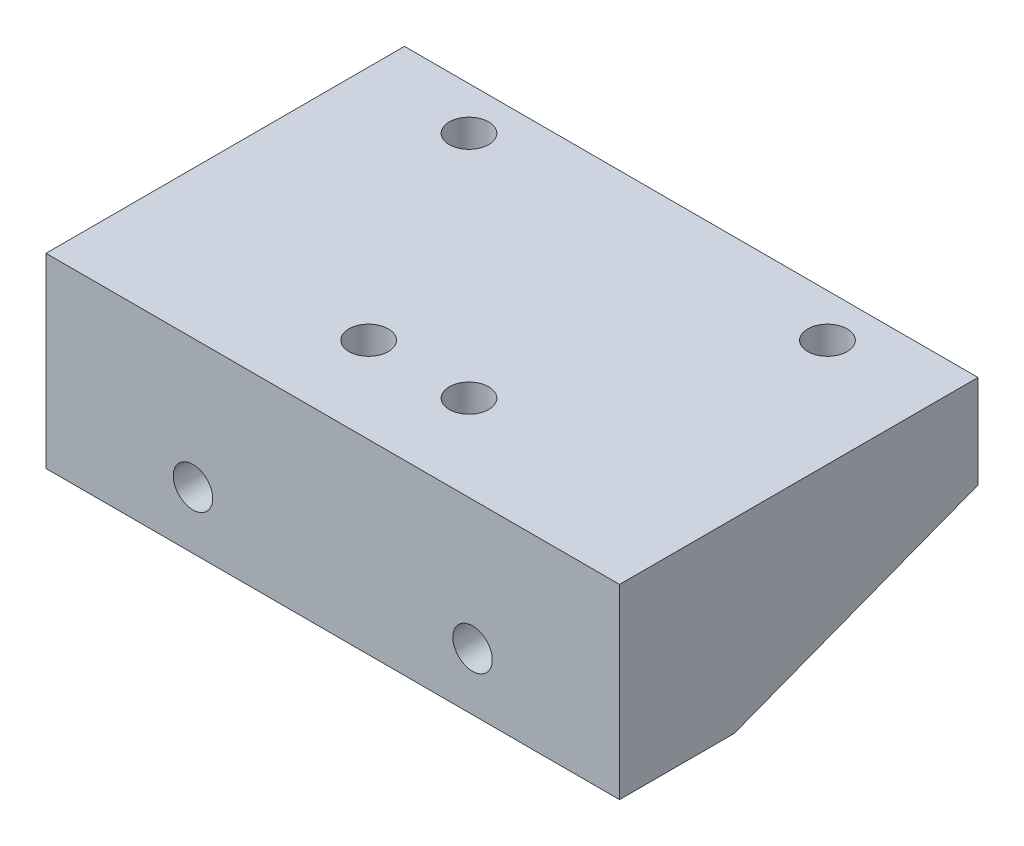
ISO-10303-21;
HEADER;
FILE_DESCRIPTION(('STEP AP214'),'2;1');
FILE_NAME('part.step','',(''),(''),'','','');
FILE_SCHEMA(('AUTOMOTIVE_DESIGN { 1 0 10303 214 1 1 1 1 }'));
ENDSEC;
DATA;
#1=APPLICATION_CONTEXT('core data for automotive mechanical design processes');
#2=APPLICATION_PROTOCOL_DEFINITION('international standard','automotive_design',2000,#1);
#3=PRODUCT_CONTEXT('',#1,'mechanical');
#4=PRODUCT('Part','Part','',(#3));
#5=PRODUCT_RELATED_PRODUCT_CATEGORY('part','',(#4));
#6=PRODUCT_DEFINITION_FORMATION('','',#4);
#7=PRODUCT_DEFINITION_CONTEXT('part definition',#1,'design');
#8=PRODUCT_DEFINITION('design','',#6,#7);
#9=PRODUCT_DEFINITION_SHAPE('','',#8);
#10=(LENGTH_UNIT() NAMED_UNIT(*) SI_UNIT(.MILLI.,.METRE.));
#11=(NAMED_UNIT(*) PLANE_ANGLE_UNIT() SI_UNIT($,.RADIAN.));
#12=(NAMED_UNIT(*) SI_UNIT($,.STERADIAN.) SOLID_ANGLE_UNIT());
#13=UNCERTAINTY_MEASURE_WITH_UNIT(LENGTH_MEASURE(1.E-05),#10,'distance_accuracy_value','');
#14=(GEOMETRIC_REPRESENTATION_CONTEXT(3) GLOBAL_UNCERTAINTY_ASSIGNED_CONTEXT((#13)) GLOBAL_UNIT_ASSIGNED_CONTEXT((#10,
#11,#12)) REPRESENTATION_CONTEXT('',''));
#15=CARTESIAN_POINT('',(0.,0.,0.));
#16=DIRECTION('',(0.,0.,1.));
#17=DIRECTION('',(1.,0.,0.));
#18=AXIS2_PLACEMENT_3D('',#15,#16,#17);
#19=CARTESIAN_POINT('',(0.,0.,6.));
#20=DIRECTION('',(0.,1.,0.));
#21=DIRECTION('',(0.,0.,1.));
#22=AXIS2_PLACEMENT_3D('',#19,#20,#21);
#23=PLANE('',#22);
#24=DIRECTION('',(0.,0.,1.));
#25=VECTOR('',#24,1.);
#26=CARTESIAN_POINT('',(0.,0.,-44.));
#27=LINE('',#26,#25);
#28=CARTESIAN_POINT('',(0.,0.,-10.));
#29=VERTEX_POINT('',#28);
#30=CARTESIAN_POINT('',(0.,0.,-3.5));
#31=VERTEX_POINT('',#30);
#32=EDGE_CURVE('E195',#29,#31,#27,.T.);
#33=ORIENTED_EDGE('',*,*,#32,.T.);
#34=CARTESIAN_POINT('',(3.5,0.,-3.5));
#35=DIRECTION('',(0.,1.,0.));
#36=DIRECTION('',(0.,0.,1.));
#37=AXIS2_PLACEMENT_3D('',#34,#35,#36);
#38=CIRCLE('',#37,3.5);
#39=CARTESIAN_POINT('',(3.5,0.,0.));
#40=VERTEX_POINT('',#39);
#41=EDGE_CURVE('E302',#31,#40,#38,.T.);
#42=ORIENTED_EDGE('',*,*,#41,.T.);
#43=DIRECTION('',(1.,0.,0.));
#44=VECTOR('',#43,1.);
#45=CARTESIAN_POINT('',(0.,0.,0.));
#46=LINE('',#45,#44);
#47=CARTESIAN_POINT('',(58.5,0.,0.));
#48=VERTEX_POINT('',#47);
#49=EDGE_CURVE('E269',#40,#48,#46,.T.);
#50=ORIENTED_EDGE('',*,*,#49,.T.);
#51=CARTESIAN_POINT('',(58.5,0.,-3.5));
#52=DIRECTION('',(0.,1.,0.));
#53=DIRECTION('',(0.,0.,1.));
#54=AXIS2_PLACEMENT_3D('',#51,#52,#53);
#55=CIRCLE('',#54,3.5);
#56=CARTESIAN_POINT('',(62.,0.,-3.5));
#57=VERTEX_POINT('',#56);
#58=EDGE_CURVE('E299',#48,#57,#55,.T.);
#59=ORIENTED_EDGE('',*,*,#58,.T.);
#60=DIRECTION('',(0.,0.,-1.));
#61=VECTOR('',#60,1.);
#62=CARTESIAN_POINT('',(62.,0.,6.));
#63=LINE('',#62,#61);
#64=CARTESIAN_POINT('',(62.,0.,-10.));
#65=VERTEX_POINT('',#64);
#66=EDGE_CURVE('E215',#57,#65,#63,.T.);
#67=ORIENTED_EDGE('',*,*,#66,.T.);
#68=DIRECTION('',(1.,0.,0.));
#69=VECTOR('',#68,1.);
#70=CARTESIAN_POINT('',(9.50238100637324,0.,-10.));
#71=LINE('',#70,#69);
#72=CARTESIAN_POINT('',(71.,0.,-10.));
#73=VERTEX_POINT('',#72);
#74=EDGE_CURVE('E221',#65,#73,#71,.T.);
#75=ORIENTED_EDGE('',*,*,#74,.T.);
#76=DIRECTION('',(0.,0.,-1.));
#77=VECTOR('',#76,1.);
#78=CARTESIAN_POINT('',(71.,0.,6.));
#79=LINE('',#78,#77);
#80=CARTESIAN_POINT('',(71.,0.,6.));
#81=VERTEX_POINT('',#80);
#82=EDGE_CURVE('E210',#81,#73,#79,.T.);
#83=ORIENTED_EDGE('',*,*,#82,.F.);
#84=DIRECTION('',(1.,0.,0.));
#85=VECTOR('',#84,1.);
#86=CARTESIAN_POINT('',(0.,0.,6.));
#87=LINE('',#86,#85);
#88=CARTESIAN_POINT('',(-9.,0.,6.));
#89=VERTEX_POINT('',#88);
#90=EDGE_CURVE('E273',#89,#81,#87,.T.);
#91=ORIENTED_EDGE('',*,*,#90,.F.);
#92=DIRECTION('',(0.,0.,1.));
#93=VECTOR('',#92,1.);
#94=CARTESIAN_POINT('',(-9.,0.,-44.));
#95=LINE('',#94,#93);
#96=CARTESIAN_POINT('',(-9.,0.,-10.));
#97=VERTEX_POINT('',#96);
#98=EDGE_CURVE('E190',#97,#89,#95,.T.);
#99=ORIENTED_EDGE('',*,*,#98,.F.);
#100=DIRECTION('',(-1.,0.,0.));
#101=VECTOR('',#100,1.);
#102=CARTESIAN_POINT('',(52.4976189936268,0.,-10.));
#103=LINE('',#102,#101);
#104=EDGE_CURVE('E187',#29,#97,#103,.T.);
#105=ORIENTED_EDGE('',*,*,#104,.F.);
#106=EDGE_LOOP('',(#33,#42,#50,#59,#67,#75,#83,#91,#99,#105));
#107=FACE_BOUND('',#106,.T.);
#108=ADVANCED_FACE('F51',(#107),#23,.F.);
#109=CARTESIAN_POINT('',(0.,26.,6.));
#110=DIRECTION('',(0.,-1.,0.));
#111=DIRECTION('',(0.,0.,-1.));
#112=AXIS2_PLACEMENT_3D('',#109,#110,#111);
#113=PLANE('',#112);
#114=CARTESIAN_POINT('',(38.,26.,-6.00000000000002));
#115=DIRECTION('',(0.,-1.,0.));
#116=DIRECTION('',(0.,0.,-1.));
#117=AXIS2_PLACEMENT_3D('',#114,#115,#116);
#118=CIRCLE('',#117,2.74999999999999);
#119=CARTESIAN_POINT('',(38.,26.,-8.75));
#120=VERTEX_POINT('',#119);
#121=EDGE_CURVE('E359',#120,#120,#118,.T.);
#122=ORIENTED_EDGE('',*,*,#121,.T.);
#123=EDGE_LOOP('',(#122));
#124=FACE_BOUND('',#123,.T.);
#125=CARTESIAN_POINT('',(24.,26.,-6.00000000000002));
#126=DIRECTION('',(0.,-1.,0.));
#127=DIRECTION('',(0.,0.,-1.));
#128=AXIS2_PLACEMENT_3D('',#125,#126,#127);
#129=CIRCLE('',#128,2.74999999999999);
#130=CARTESIAN_POINT('',(24.,26.,-8.75));
#131=VERTEX_POINT('',#130);
#132=EDGE_CURVE('E371',#131,#131,#129,.T.);
#133=ORIENTED_EDGE('',*,*,#132,.T.);
#134=EDGE_LOOP('',(#133));
#135=FACE_BOUND('',#134,.T.);
#136=CARTESIAN_POINT('',(56.,26.,-38.));
#137=DIRECTION('',(0.,-1.,0.));
#138=DIRECTION('',(0.,0.,-1.));
#139=AXIS2_PLACEMENT_3D('',#136,#137,#138);
#140=CIRCLE('',#139,2.74999999999999);
#141=CARTESIAN_POINT('',(56.,26.,-40.75));
#142=VERTEX_POINT('',#141);
#143=EDGE_CURVE('E379',#142,#142,#140,.T.);
#144=ORIENTED_EDGE('',*,*,#143,.T.);
#145=EDGE_LOOP('',(#144));
#146=FACE_BOUND('',#145,.T.);
#147=CARTESIAN_POINT('',(6.,26.,-38.));
#148=DIRECTION('',(0.,-1.,0.));
#149=DIRECTION('',(0.,0.,-1.));
#150=AXIS2_PLACEMENT_3D('',#147,#148,#149);
#151=CIRCLE('',#150,2.74999999999999);
#152=CARTESIAN_POINT('',(6.,26.,-40.75));
#153=VERTEX_POINT('',#152);
#154=EDGE_CURVE('E191',#153,#153,#151,.T.);
#155=ORIENTED_EDGE('',*,*,#154,.T.);
#156=EDGE_LOOP('',(#155));
#157=FACE_BOUND('',#156,.T.);
#158=DIRECTION('',(-1.,0.,0.));
#159=VECTOR('',#158,1.);
#160=CARTESIAN_POINT('',(0.,26.,6.));
#161=LINE('',#160,#159);
#162=CARTESIAN_POINT('',(71.,26.,6.));
#163=VERTEX_POINT('',#162);
#164=CARTESIAN_POINT('',(-9.,26.,6.));
#165=VERTEX_POINT('',#164);
#166=EDGE_CURVE('E276',#163,#165,#161,.T.);
#167=ORIENTED_EDGE('',*,*,#166,.F.);
#168=DIRECTION('',(0.,0.,1.));
#169=VECTOR('',#168,1.);
#170=CARTESIAN_POINT('',(71.,26.,-44.));
#171=LINE('',#170,#169);
#172=CARTESIAN_POINT('',(71.,26.,-44.));
#173=VERTEX_POINT('',#172);
#174=EDGE_CURVE('E259',#173,#163,#171,.T.);
#175=ORIENTED_EDGE('',*,*,#174,.F.);
#176=DIRECTION('',(-1.,0.,0.));
#177=VECTOR('',#176,1.);
#178=CARTESIAN_POINT('',(-9.,26.,-44.));
#179=LINE('',#178,#177);
#180=CARTESIAN_POINT('',(-9.,26.,-44.));
#181=VERTEX_POINT('',#180);
#182=EDGE_CURVE('E256',#173,#181,#179,.T.);
#183=ORIENTED_EDGE('',*,*,#182,.T.);
#184=DIRECTION('',(0.,0.,1.));
#185=VECTOR('',#184,1.);
#186=CARTESIAN_POINT('',(-9.,26.,-44.));
#187=LINE('',#186,#185);
#188=EDGE_CURVE('E168',#181,#165,#187,.T.);
#189=ORIENTED_EDGE('',*,*,#188,.T.);
#190=EDGE_LOOP('',(#167,#175,#183,#189));
#191=FACE_BOUND('',#190,.T.);
#192=ADVANCED_FACE('F436',(#124,#135,#146,#157,#191),#113,.F.);
#193=CARTESIAN_POINT('',(0.,0.,6.));
#194=DIRECTION('',(0.,0.,-1.));
#195=DIRECTION('',(-1.,0.,0.));
#196=AXIS2_PLACEMENT_3D('',#193,#194,#195);
#197=PLANE('',#196);
#198=DIRECTION('',(0.,-1.,0.));
#199=VECTOR('',#198,1.);
#200=CARTESIAN_POINT('',(-9.,26.,6.));
#201=LINE('',#200,#199);
#202=EDGE_CURVE('E260',#165,#89,#201,.T.);
#203=ORIENTED_EDGE('',*,*,#202,.T.);
#204=ORIENTED_EDGE('',*,*,#90,.T.);
#205=DIRECTION('',(0.,1.,0.));
#206=VECTOR('',#205,1.);
#207=CARTESIAN_POINT('',(71.,26.,6.));
#208=LINE('',#207,#206);
#209=EDGE_CURVE('E173',#81,#163,#208,.T.);
#210=ORIENTED_EDGE('',*,*,#209,.T.);
#211=ORIENTED_EDGE('',*,*,#166,.T.);
#212=EDGE_LOOP('',(#203,#204,#210,#211));
#213=FACE_BOUND('',#212,.T.);
#214=CARTESIAN_POINT('',(50.5,8.,6.));
#215=DIRECTION('',(0.,0.,-1.));
#216=DIRECTION('',(-1.,0.,0.));
#217=AXIS2_PLACEMENT_3D('',#214,#215,#216);
#218=CIRCLE('',#217,2.74999999999999);
#219=CARTESIAN_POINT('',(47.75,8.,6.));
#220=VERTEX_POINT('',#219);
#221=EDGE_CURVE('E240',#220,#220,#218,.T.);
#222=ORIENTED_EDGE('',*,*,#221,.T.);
#223=EDGE_LOOP('',(#222));
#224=FACE_BOUND('',#223,.T.);
#225=CARTESIAN_POINT('',(11.5,8.,6.));
#226=DIRECTION('',(0.,0.,-1.));
#227=DIRECTION('',(-1.,0.,0.));
#228=AXIS2_PLACEMENT_3D('',#225,#226,#227);
#229=CIRCLE('',#228,2.74999999999999);
#230=CARTESIAN_POINT('',(8.75000000000001,8.,6.));
#231=VERTEX_POINT('',#230);
#232=EDGE_CURVE('E247',#231,#231,#229,.T.);
#233=ORIENTED_EDGE('',*,*,#232,.T.);
#234=EDGE_LOOP('',(#233));
#235=FACE_BOUND('',#234,.T.);
#236=ADVANCED_FACE('F443',(#213,#224,#235),#197,.F.);
#237=CARTESIAN_POINT('',(0.,0.,0.));
#238=DIRECTION('',(0.,0.,-1.));
#239=DIRECTION('',(-1.,0.,0.));
#240=AXIS2_PLACEMENT_3D('',#237,#238,#239);
#241=PLANE('',#240);
#242=CARTESIAN_POINT('',(50.5,8.,0.));
#243=DIRECTION('',(0.,0.,-1.));
#244=DIRECTION('',(-1.,0.,0.));
#245=AXIS2_PLACEMENT_3D('',#242,#243,#244);
#246=CIRCLE('',#245,2.74999999999999);
#247=CARTESIAN_POINT('',(47.75,8.,0.));
#248=VERTEX_POINT('',#247);
#249=EDGE_CURVE('E226',#248,#248,#246,.T.);
#250=ORIENTED_EDGE('',*,*,#249,.F.);
#251=EDGE_LOOP('',(#250));
#252=FACE_BOUND('',#251,.T.);
#253=CARTESIAN_POINT('',(11.5,8.,0.));
#254=DIRECTION('',(0.,0.,-1.));
#255=DIRECTION('',(-1.,0.,0.));
#256=AXIS2_PLACEMENT_3D('',#253,#254,#255);
#257=CIRCLE('',#256,2.74999999999999);
#258=CARTESIAN_POINT('',(8.75000000000001,8.,0.));
#259=VERTEX_POINT('',#258);
#260=EDGE_CURVE('E244',#259,#259,#257,.T.);
#261=ORIENTED_EDGE('',*,*,#260,.F.);
#262=EDGE_LOOP('',(#261));
#263=FACE_BOUND('',#262,.T.);
#264=DIRECTION('',(0.,-1.,0.));
#265=VECTOR('',#264,1.);
#266=CARTESIAN_POINT('',(3.5,16.,0.));
#267=LINE('',#266,#265);
#268=CARTESIAN_POINT('',(3.5,15.,0.));
#269=VERTEX_POINT('',#268);
#270=EDGE_CURVE('E289',#40,#269,#267,.F.);
#271=ORIENTED_EDGE('',*,*,#270,.T.);
#272=DIRECTION('',(-1.,0.,0.));
#273=VECTOR('',#272,1.);
#274=CARTESIAN_POINT('',(58.5,15.,0.));
#275=LINE('',#274,#273);
#276=CARTESIAN_POINT('',(58.5,15.,0.));
#277=VERTEX_POINT('',#276);
#278=EDGE_CURVE('E327',#269,#277,#275,.F.);
#279=ORIENTED_EDGE('',*,*,#278,.T.);
#280=DIRECTION('',(0.,1.,0.));
#281=VECTOR('',#280,1.);
#282=CARTESIAN_POINT('',(58.5,0.,0.));
#283=LINE('',#282,#281);
#284=EDGE_CURVE('E293',#277,#48,#283,.F.);
#285=ORIENTED_EDGE('',*,*,#284,.T.);
#286=ORIENTED_EDGE('',*,*,#49,.F.);
#287=EDGE_LOOP('',(#271,#279,#285,#286));
#288=FACE_BOUND('',#287,.T.);
#289=ADVANCED_FACE('F392',(#252,#263,#288),#241,.T.);
#290=CARTESIAN_POINT('',(-9.,16.,-44.));
#291=DIRECTION('',(0.,-1.,0.));
#292=DIRECTION('',(0.,0.,-1.));
#293=AXIS2_PLACEMENT_3D('',#290,#291,#292);
#294=PLANE('',#293);
#295=CARTESIAN_POINT('',(38.,16.,-6.00000000000002));
#296=DIRECTION('',(0.,-1.,0.));
#297=DIRECTION('',(0.,0.,-1.));
#298=AXIS2_PLACEMENT_3D('',#295,#296,#297);
#299=CIRCLE('',#298,2.74999999999999);
#300=CARTESIAN_POINT('',(38.,16.,-8.75));
#301=VERTEX_POINT('',#300);
#302=EDGE_CURVE('E352',#301,#301,#299,.T.);
#303=ORIENTED_EDGE('',*,*,#302,.F.);
#304=EDGE_LOOP('',(#303));
#305=FACE_BOUND('',#304,.T.);
#306=CARTESIAN_POINT('',(24.,16.,-6.00000000000002));
#307=DIRECTION('',(0.,-1.,0.));
#308=DIRECTION('',(0.,0.,-1.));
#309=AXIS2_PLACEMENT_3D('',#306,#307,#308);
#310=CIRCLE('',#309,2.74999999999999);
#311=CARTESIAN_POINT('',(24.,16.,-8.75000000000001));
#312=VERTEX_POINT('',#311);
#313=EDGE_CURVE('E365',#312,#312,#310,.T.);
#314=ORIENTED_EDGE('',*,*,#313,.F.);
#315=EDGE_LOOP('',(#314));
#316=FACE_BOUND('',#315,.T.);
#317=CARTESIAN_POINT('',(56.,16.,-38.));
#318=DIRECTION('',(0.,-1.,0.));
#319=DIRECTION('',(0.,0.,-1.));
#320=AXIS2_PLACEMENT_3D('',#317,#318,#319);
#321=CIRCLE('',#320,2.74999999999999);
#322=CARTESIAN_POINT('',(56.,16.,-40.75));
#323=VERTEX_POINT('',#322);
#324=EDGE_CURVE('E375',#323,#323,#321,.T.);
#325=ORIENTED_EDGE('',*,*,#324,.F.);
#326=EDGE_LOOP('',(#325));
#327=FACE_BOUND('',#326,.T.);
#328=CARTESIAN_POINT('',(6.,16.,-38.));
#329=DIRECTION('',(0.,-1.,0.));
#330=DIRECTION('',(0.,0.,-1.));
#331=AXIS2_PLACEMENT_3D('',#328,#329,#330);
#332=CIRCLE('',#331,2.74999999999999);
#333=CARTESIAN_POINT('',(6.,16.,-40.75));
#334=VERTEX_POINT('',#333);
#335=EDGE_CURVE('E198',#334,#334,#332,.T.);
#336=ORIENTED_EDGE('',*,*,#335,.F.);
#337=EDGE_LOOP('',(#336));
#338=FACE_BOUND('',#337,.T.);
#339=DIRECTION('',(1.,0.,0.));
#340=VECTOR('',#339,1.);
#341=CARTESIAN_POINT('',(-9.,16.,-44.));
#342=LINE('',#341,#340);
#343=CARTESIAN_POINT('',(1.,16.,-44.));
#344=VERTEX_POINT('',#343);
#345=CARTESIAN_POINT('',(61.,16.,-44.));
#346=VERTEX_POINT('',#345);
#347=EDGE_CURVE('E172',#344,#346,#342,.T.);
#348=ORIENTED_EDGE('',*,*,#347,.T.);
#349=DIRECTION('',(0.,0.,1.));
#350=VECTOR('',#349,1.);
#351=CARTESIAN_POINT('',(61.,16.,-3.5));
#352=LINE('',#351,#350);
#353=CARTESIAN_POINT('',(61.,16.,-3.5));
#354=VERTEX_POINT('',#353);
#355=EDGE_CURVE('E317',#346,#354,#352,.T.);
#356=ORIENTED_EDGE('',*,*,#355,.T.);
#357=CARTESIAN_POINT('',(58.5,16.,-3.5));
#358=DIRECTION('',(0.,-1.,0.));
#359=DIRECTION('',(0.,0.,-1.));
#360=AXIS2_PLACEMENT_3D('',#357,#358,#359);
#361=CIRCLE('',#360,2.5);
#362=CARTESIAN_POINT('',(58.5,16.,-1.));
#363=VERTEX_POINT('',#362);
#364=EDGE_CURVE('E314',#354,#363,#361,.T.);
#365=ORIENTED_EDGE('',*,*,#364,.T.);
#366=DIRECTION('',(-1.,0.,0.));
#367=VECTOR('',#366,1.);
#368=CARTESIAN_POINT('',(3.5,16.,-1.));
#369=LINE('',#368,#367);
#370=CARTESIAN_POINT('',(3.5,16.,-1.));
#371=VERTEX_POINT('',#370);
#372=EDGE_CURVE('E311',#363,#371,#369,.T.);
#373=ORIENTED_EDGE('',*,*,#372,.T.);
#374=CARTESIAN_POINT('',(3.5,16.,-3.5));
#375=DIRECTION('',(0.,-1.,0.));
#376=DIRECTION('',(0.,0.,-1.));
#377=AXIS2_PLACEMENT_3D('',#374,#375,#376);
#378=CIRCLE('',#377,2.5);
#379=CARTESIAN_POINT('',(1.,16.,-3.5));
#380=VERTEX_POINT('',#379);
#381=EDGE_CURVE('E308',#371,#380,#378,.T.);
#382=ORIENTED_EDGE('',*,*,#381,.T.);
#383=DIRECTION('',(0.,0.,-1.));
#384=VECTOR('',#383,1.);
#385=CARTESIAN_POINT('',(1.,16.,-44.));
#386=LINE('',#385,#384);
#387=EDGE_CURVE('E305',#380,#344,#386,.T.);
#388=ORIENTED_EDGE('',*,*,#387,.T.);
#389=EDGE_LOOP('',(#348,#356,#365,#373,#382,#388));
#390=FACE_BOUND('',#389,.T.);
#391=ADVANCED_FACE('F389',(#305,#316,#327,#338,#390),#294,.T.);
#392=CARTESIAN_POINT('',(-9.,26.,-44.));
#393=DIRECTION('',(-1.,0.,0.));
#394=DIRECTION('',(0.,0.,1.));
#395=AXIS2_PLACEMENT_3D('',#392,#393,#394);
#396=PLANE('',#395);
#397=ORIENTED_EDGE('',*,*,#202,.F.);
#398=ORIENTED_EDGE('',*,*,#188,.F.);
#399=DIRECTION('',(0.,-1.,0.));
#400=VECTOR('',#399,1.);
#401=CARTESIAN_POINT('',(-9.,26.,-44.));
#402=LINE('',#401,#400);
#403=CARTESIAN_POINT('',(-9.,13.,-44.));
#404=VERTEX_POINT('',#403);
#405=EDGE_CURVE('E160',#181,#404,#402,.T.);
#406=ORIENTED_EDGE('',*,*,#405,.T.);
#407=DIRECTION('',(0.,-0.357137466266591,0.934051834851085));
#408=VECTOR('',#407,1.);
#409=CARTESIAN_POINT('',(-9.,14.6581132075472,-48.3366037735849));
#410=LINE('',#409,#408);
#411=EDGE_CURVE('E166',#404,#97,#410,.T.);
#412=ORIENTED_EDGE('',*,*,#411,.T.);
#413=ORIENTED_EDGE('',*,*,#98,.T.);
#414=EDGE_LOOP('',(#397,#398,#406,#412,#413));
#415=FACE_BOUND('',#414,.T.);
#416=ADVANCED_FACE('F163',(#415),#396,.T.);
#417=CARTESIAN_POINT('',(71.,26.,-44.));
#418=DIRECTION('',(1.,0.,0.));
#419=DIRECTION('',(0.,0.,-1.));
#420=AXIS2_PLACEMENT_3D('',#417,#418,#419);
#421=PLANE('',#420);
#422=ORIENTED_EDGE('',*,*,#209,.F.);
#423=ORIENTED_EDGE('',*,*,#82,.T.);
#424=DIRECTION('',(0.,0.357137466266591,-0.934051834851085));
#425=VECTOR('',#424,1.);
#426=CARTESIAN_POINT('',(71.,13.,-44.));
#427=LINE('',#426,#425);
#428=CARTESIAN_POINT('',(71.,13.,-44.));
#429=VERTEX_POINT('',#428);
#430=EDGE_CURVE('E211',#73,#429,#427,.T.);
#431=ORIENTED_EDGE('',*,*,#430,.T.);
#432=DIRECTION('',(0.,1.,0.));
#433=VECTOR('',#432,1.);
#434=CARTESIAN_POINT('',(71.,26.,-44.));
#435=LINE('',#434,#433);
#436=EDGE_CURVE('E252',#429,#173,#435,.T.);
#437=ORIENTED_EDGE('',*,*,#436,.T.);
#438=ORIENTED_EDGE('',*,*,#174,.T.);
#439=EDGE_LOOP('',(#422,#423,#431,#437,#438));
#440=FACE_BOUND('',#439,.T.);
#441=ADVANCED_FACE('F588',(#440),#421,.T.);
#442=CARTESIAN_POINT('',(0.,0.,-44.));
#443=DIRECTION('',(0.,0.,1.));
#444=DIRECTION('',(1.,0.,0.));
#445=AXIS2_PLACEMENT_3D('',#442,#443,#444);
#446=PLANE('',#445);
#447=ORIENTED_EDGE('',*,*,#405,.F.);
#448=ORIENTED_EDGE('',*,*,#182,.F.);
#449=ORIENTED_EDGE('',*,*,#436,.F.);
#450=DIRECTION('',(1.,0.,0.));
#451=VECTOR('',#450,1.);
#452=CARTESIAN_POINT('',(9.50238100637324,13.,-44.));
#453=LINE('',#452,#451);
#454=CARTESIAN_POINT('',(62.,13.,-44.));
#455=VERTEX_POINT('',#454);
#456=EDGE_CURVE('E227',#455,#429,#453,.T.);
#457=ORIENTED_EDGE('',*,*,#456,.F.);
#458=DIRECTION('',(0.,1.,0.));
#459=VECTOR('',#458,1.);
#460=CARTESIAN_POINT('',(62.,16.,-44.));
#461=LINE('',#460,#459);
#462=CARTESIAN_POINT('',(62.,15.,-44.));
#463=VERTEX_POINT('',#462);
#464=EDGE_CURVE('E222',#455,#463,#461,.T.);
#465=ORIENTED_EDGE('',*,*,#464,.T.);
#466=CARTESIAN_POINT('',(61.,15.,-44.));
#467=DIRECTION('',(0.,0.,1.));
#468=DIRECTION('',(1.,0.,0.));
#469=AXIS2_PLACEMENT_3D('',#466,#467,#468);
#470=CIRCLE('',#469,1.);
#471=EDGE_CURVE('E61',#463,#346,#470,.T.);
#472=ORIENTED_EDGE('',*,*,#471,.T.);
#473=ORIENTED_EDGE('',*,*,#347,.F.);
#474=CARTESIAN_POINT('',(1.,15.,-44.));
#475=DIRECTION('',(0.,0.,1.));
#476=DIRECTION('',(1.,0.,0.));
#477=AXIS2_PLACEMENT_3D('',#474,#475,#476);
#478=CIRCLE('',#477,1.);
#479=CARTESIAN_POINT('',(0.,15.,-44.));
#480=VERTEX_POINT('',#479);
#481=EDGE_CURVE('E11',#344,#480,#478,.T.);
#482=ORIENTED_EDGE('',*,*,#481,.T.);
#483=DIRECTION('',(0.,-1.,0.));
#484=VECTOR('',#483,1.);
#485=CARTESIAN_POINT('',(0.,26.,-44.));
#486=LINE('',#485,#484);
#487=CARTESIAN_POINT('',(0.,13.,-44.));
#488=VERTEX_POINT('',#487);
#489=EDGE_CURVE('E178',#480,#488,#486,.T.);
#490=ORIENTED_EDGE('',*,*,#489,.T.);
#491=DIRECTION('',(-1.,0.,0.));
#492=VECTOR('',#491,1.);
#493=CARTESIAN_POINT('',(52.4976189936268,13.,-44.));
#494=LINE('',#493,#492);
#495=EDGE_CURVE('E176',#488,#404,#494,.T.);
#496=ORIENTED_EDGE('',*,*,#495,.T.);
#497=EDGE_LOOP('',(#447,#448,#449,#457,#465,#472,#473,#482,#490,#496));
#498=FACE_BOUND('',#497,.T.);
#499=ADVANCED_FACE('F177',(#498),#446,.F.);
#500=CARTESIAN_POINT('',(11.5,8.,0.));
#501=DIRECTION('',(0.,0.,-1.));
#502=DIRECTION('',(-1.,0.,0.));
#503=AXIS2_PLACEMENT_3D('',#500,#501,#502);
#504=CYLINDRICAL_SURFACE('',#503,2.74999999999999);
#505=ORIENTED_EDGE('',*,*,#260,.T.);
#506=EDGE_LOOP('',(#505));
#507=FACE_BOUND('',#506,.T.);
#508=ORIENTED_EDGE('',*,*,#232,.F.);
#509=EDGE_LOOP('',(#508));
#510=FACE_BOUND('',#509,.T.);
#511=ADVANCED_FACE('F570',(#507,#510),#504,.F.);
#512=CARTESIAN_POINT('',(50.5,8.,0.));
#513=DIRECTION('',(0.,0.,-1.));
#514=DIRECTION('',(-1.,0.,0.));
#515=AXIS2_PLACEMENT_3D('',#512,#513,#514);
#516=CYLINDRICAL_SURFACE('',#515,2.74999999999999);
#517=ORIENTED_EDGE('',*,*,#249,.T.);
#518=EDGE_LOOP('',(#517));
#519=FACE_BOUND('',#518,.T.);
#520=ORIENTED_EDGE('',*,*,#221,.F.);
#521=EDGE_LOOP('',(#520));
#522=FACE_BOUND('',#521,.T.);
#523=ADVANCED_FACE('F561',(#519,#522),#516,.F.);
#524=CARTESIAN_POINT('',(62.,0.,6.));
#525=DIRECTION('',(-1.,0.,0.));
#526=DIRECTION('',(0.,0.,1.));
#527=AXIS2_PLACEMENT_3D('',#524,#525,#526);
#528=PLANE('',#527);
#529=DIRECTION('',(0.,1.,0.));
#530=VECTOR('',#529,1.);
#531=CARTESIAN_POINT('',(62.,16.,-3.5));
#532=LINE('',#531,#530);
#533=CARTESIAN_POINT('',(62.,15.,-3.5));
#534=VERTEX_POINT('',#533);
#535=EDGE_CURVE('E279',#57,#534,#532,.T.);
#536=ORIENTED_EDGE('',*,*,#535,.T.);
#537=DIRECTION('',(0.,0.,1.));
#538=VECTOR('',#537,1.);
#539=CARTESIAN_POINT('',(62.,15.,-44.));
#540=LINE('',#539,#538);
#541=EDGE_CURVE('E321',#534,#463,#540,.F.);
#542=ORIENTED_EDGE('',*,*,#541,.T.);
#543=ORIENTED_EDGE('',*,*,#464,.F.);
#544=DIRECTION('',(0.,0.357137466266591,-0.934051834851085));
#545=VECTOR('',#544,1.);
#546=CARTESIAN_POINT('',(62.,13.,-44.));
#547=LINE('',#546,#545);
#548=EDGE_CURVE('E228',#65,#455,#547,.T.);
#549=ORIENTED_EDGE('',*,*,#548,.F.);
#550=ORIENTED_EDGE('',*,*,#66,.F.);
#551=EDGE_LOOP('',(#536,#542,#543,#549,#550));
#552=FACE_BOUND('',#551,.T.);
#553=ADVANCED_FACE('F415',(#552),#528,.T.);
#554=CARTESIAN_POINT('',(9.50238100637324,13.,-44.));
#555=DIRECTION('',(0.,-0.934051834851085,-0.357137466266591));
#556=DIRECTION('',(0.,0.357137466266591,-0.934051834851085));
#557=AXIS2_PLACEMENT_3D('',#554,#555,#556);
#558=PLANE('',#557);
#559=ORIENTED_EDGE('',*,*,#74,.F.);
#560=ORIENTED_EDGE('',*,*,#548,.T.);
#561=ORIENTED_EDGE('',*,*,#456,.T.);
#562=ORIENTED_EDGE('',*,*,#430,.F.);
#563=EDGE_LOOP('',(#559,#560,#561,#562));
#564=FACE_BOUND('',#563,.T.);
#565=ADVANCED_FACE('F544',(#564),#558,.T.);
#566=CARTESIAN_POINT('',(0.,0.,6.));
#567=DIRECTION('',(1.,0.,0.));
#568=DIRECTION('',(0.,0.,-1.));
#569=AXIS2_PLACEMENT_3D('',#566,#567,#568);
#570=PLANE('',#569);
#571=ORIENTED_EDGE('',*,*,#489,.F.);
#572=DIRECTION('',(0.,0.,-1.));
#573=VECTOR('',#572,1.);
#574=CARTESIAN_POINT('',(0.,15.,-3.5));
#575=LINE('',#574,#573);
#576=CARTESIAN_POINT('',(0.,15.,-3.5));
#577=VERTEX_POINT('',#576);
#578=EDGE_CURVE('E74',#480,#577,#575,.F.);
#579=ORIENTED_EDGE('',*,*,#578,.T.);
#580=DIRECTION('',(0.,-1.,0.));
#581=VECTOR('',#580,1.);
#582=CARTESIAN_POINT('',(0.,0.,-3.5));
#583=LINE('',#582,#581);
#584=EDGE_CURVE('E296',#577,#31,#583,.T.);
#585=ORIENTED_EDGE('',*,*,#584,.T.);
#586=ORIENTED_EDGE('',*,*,#32,.F.);
#587=DIRECTION('',(0.,-0.357137466266591,0.934051834851086));
#588=VECTOR('',#587,1.);
#589=CARTESIAN_POINT('',(0.,14.6581132075472,-48.3366037735849));
#590=LINE('',#589,#588);
#591=EDGE_CURVE('E183',#488,#29,#590,.T.);
#592=ORIENTED_EDGE('',*,*,#591,.F.);
#593=EDGE_LOOP('',(#571,#579,#585,#586,#592));
#594=FACE_BOUND('',#593,.T.);
#595=ADVANCED_FACE('F536',(#594),#570,.T.);
#596=CARTESIAN_POINT('',(52.4976189936268,14.6581132075472,-48.3366037735849));
#597=DIRECTION('',(0.,-0.934051834851085,-0.357137466266591));
#598=DIRECTION('',(0.,0.357137466266591,-0.934051834851086));
#599=AXIS2_PLACEMENT_3D('',#596,#597,#598);
#600=PLANE('',#599);
#601=ORIENTED_EDGE('',*,*,#495,.F.);
#602=ORIENTED_EDGE('',*,*,#591,.T.);
#603=ORIENTED_EDGE('',*,*,#104,.T.);
#604=ORIENTED_EDGE('',*,*,#411,.F.);
#605=EDGE_LOOP('',(#601,#602,#603,#604));
#606=FACE_BOUND('',#605,.T.);
#607=ADVANCED_FACE('F185',(#606),#600,.T.);
#608=CARTESIAN_POINT('',(6.,16.,-38.));
#609=DIRECTION('',(0.,-1.,0.));
#610=DIRECTION('',(0.,0.,-1.));
#611=AXIS2_PLACEMENT_3D('',#608,#609,#610);
#612=CYLINDRICAL_SURFACE('',#611,2.74999999999999);
#613=ORIENTED_EDGE('',*,*,#154,.F.);
#614=EDGE_LOOP('',(#613));
#615=FACE_BOUND('',#614,.T.);
#616=ORIENTED_EDGE('',*,*,#335,.T.);
#617=EDGE_LOOP('',(#616));
#618=FACE_BOUND('',#617,.T.);
#619=ADVANCED_FACE('F387',(#615,#618),#612,.F.);
#620=CARTESIAN_POINT('',(56.,16.,-38.));
#621=DIRECTION('',(0.,-1.,0.));
#622=DIRECTION('',(0.,0.,-1.));
#623=AXIS2_PLACEMENT_3D('',#620,#621,#622);
#624=CYLINDRICAL_SURFACE('',#623,2.74999999999999);
#625=ORIENTED_EDGE('',*,*,#143,.F.);
#626=EDGE_LOOP('',(#625));
#627=FACE_BOUND('',#626,.T.);
#628=ORIENTED_EDGE('',*,*,#324,.T.);
#629=EDGE_LOOP('',(#628));
#630=FACE_BOUND('',#629,.T.);
#631=ADVANCED_FACE('F511',(#627,#630),#624,.F.);
#632=CARTESIAN_POINT('',(24.,16.,-6.00000000000002));
#633=DIRECTION('',(0.,-1.,0.));
#634=DIRECTION('',(0.,0.,-1.));
#635=AXIS2_PLACEMENT_3D('',#632,#633,#634);
#636=CYLINDRICAL_SURFACE('',#635,2.74999999999999);
#637=ORIENTED_EDGE('',*,*,#132,.F.);
#638=EDGE_LOOP('',(#637));
#639=FACE_BOUND('',#638,.T.);
#640=ORIENTED_EDGE('',*,*,#313,.T.);
#641=EDGE_LOOP('',(#640));
#642=FACE_BOUND('',#641,.T.);
#643=ADVANCED_FACE('F502',(#639,#642),#636,.F.);
#644=CARTESIAN_POINT('',(38.,16.,-6.00000000000002));
#645=DIRECTION('',(0.,-1.,0.));
#646=DIRECTION('',(0.,0.,-1.));
#647=AXIS2_PLACEMENT_3D('',#644,#645,#646);
#648=CYLINDRICAL_SURFACE('',#647,2.74999999999999);
#649=ORIENTED_EDGE('',*,*,#121,.F.);
#650=EDGE_LOOP('',(#649));
#651=FACE_BOUND('',#650,.T.);
#652=ORIENTED_EDGE('',*,*,#302,.T.);
#653=EDGE_LOOP('',(#652));
#654=FACE_BOUND('',#653,.T.);
#655=ADVANCED_FACE('F449',(#651,#654),#648,.F.);
#656=CARTESIAN_POINT('',(58.5,0.,-3.5));
#657=DIRECTION('',(0.,-1.,0.));
#658=DIRECTION('',(0.,0.,-1.));
#659=AXIS2_PLACEMENT_3D('',#656,#657,#658);
#660=CYLINDRICAL_SURFACE('',#659,3.5);
#661=ORIENTED_EDGE('',*,*,#284,.F.);
#662=CARTESIAN_POINT('',(58.5,15.,-3.5));
#663=DIRECTION('',(0.,-1.,0.));
#664=DIRECTION('',(0.,0.,-1.));
#665=AXIS2_PLACEMENT_3D('',#662,#663,#664);
#666=CIRCLE('',#665,3.5);
#667=EDGE_CURVE('E324',#277,#534,#666,.F.);
#668=ORIENTED_EDGE('',*,*,#667,.T.);
#669=ORIENTED_EDGE('',*,*,#535,.F.);
#670=ORIENTED_EDGE('',*,*,#58,.F.);
#671=EDGE_LOOP('',(#661,#668,#669,#670));
#672=FACE_BOUND('',#671,.T.);
#673=ADVANCED_FACE('F411',(#672),#660,.F.);
#674=CARTESIAN_POINT('',(3.5,0.,-3.5));
#675=DIRECTION('',(0.,1.,0.));
#676=DIRECTION('',(0.,0.,1.));
#677=AXIS2_PLACEMENT_3D('',#674,#675,#676);
#678=CYLINDRICAL_SURFACE('',#677,3.5);
#679=ORIENTED_EDGE('',*,*,#584,.F.);
#680=CARTESIAN_POINT('',(3.5,15.,-3.5));
#681=DIRECTION('',(0.,-1.,0.));
#682=DIRECTION('',(0.,0.,-1.));
#683=AXIS2_PLACEMENT_3D('',#680,#681,#682);
#684=CIRCLE('',#683,3.5);
#685=EDGE_CURVE('E330',#577,#269,#684,.F.);
#686=ORIENTED_EDGE('',*,*,#685,.T.);
#687=ORIENTED_EDGE('',*,*,#270,.F.);
#688=ORIENTED_EDGE('',*,*,#41,.F.);
#689=EDGE_LOOP('',(#679,#686,#687,#688));
#690=FACE_BOUND('',#689,.T.);
#691=ADVANCED_FACE('F426',(#690),#678,.F.);
#692=CARTESIAN_POINT('',(1.,15.,-44.));
#693=DIRECTION('',(0.,0.,1.));
#694=DIRECTION('',(1.,0.,0.));
#695=AXIS2_PLACEMENT_3D('',#692,#693,#694);
#696=CYLINDRICAL_SURFACE('',#695,1.);
#697=ORIENTED_EDGE('',*,*,#481,.F.);
#698=ORIENTED_EDGE('',*,*,#387,.F.);
#699=CARTESIAN_POINT('',(1.,15.,-3.5));
#700=DIRECTION('',(0.,0.,-1.));
#701=DIRECTION('',(-1.,0.,0.));
#702=AXIS2_PLACEMENT_3D('',#699,#700,#701);
#703=CIRCLE('',#702,1.);
#704=EDGE_CURVE('E55',#577,#380,#703,.T.);
#705=ORIENTED_EDGE('',*,*,#704,.F.);
#706=ORIENTED_EDGE('',*,*,#578,.F.);
#707=EDGE_LOOP('',(#697,#698,#705,#706));
#708=FACE_BOUND('',#707,.T.);
#709=ADVANCED_FACE('F53',(#708),#696,.F.);
#710=CARTESIAN_POINT('',(3.5,15.,-3.5));
#711=DIRECTION('',(0.,-1.,0.));
#712=DIRECTION('',(0.,0.,-1.));
#713=AXIS2_PLACEMENT_3D('',#710,#711,#712);
#714=TOROIDAL_SURFACE('',#713,2.5,1.);
#715=ORIENTED_EDGE('',*,*,#704,.T.);
#716=ORIENTED_EDGE('',*,*,#381,.F.);
#717=CARTESIAN_POINT('',(3.5,15.,-1.));
#718=DIRECTION('',(-1.,0.,0.));
#719=DIRECTION('',(0.,0.,1.));
#720=AXIS2_PLACEMENT_3D('',#717,#718,#719);
#721=CIRCLE('',#720,1.);
#722=EDGE_CURVE('E343',#269,#371,#721,.T.);
#723=ORIENTED_EDGE('',*,*,#722,.F.);
#724=ORIENTED_EDGE('',*,*,#685,.F.);
#725=EDGE_LOOP('',(#715,#716,#723,#724));
#726=FACE_BOUND('',#725,.T.);
#727=ADVANCED_FACE('F427',(#726),#714,.F.);
#728=CARTESIAN_POINT('',(-9.,15.,-1.));
#729=DIRECTION('',(1.,0.,0.));
#730=DIRECTION('',(0.,0.,-1.));
#731=AXIS2_PLACEMENT_3D('',#728,#729,#730);
#732=CYLINDRICAL_SURFACE('',#731,1.);
#733=ORIENTED_EDGE('',*,*,#722,.T.);
#734=ORIENTED_EDGE('',*,*,#372,.F.);
#735=CARTESIAN_POINT('',(58.5,15.,-1.));
#736=DIRECTION('',(-1.,0.,0.));
#737=DIRECTION('',(0.,0.,1.));
#738=AXIS2_PLACEMENT_3D('',#735,#736,#737);
#739=CIRCLE('',#738,1.);
#740=EDGE_CURVE('E340',#277,#363,#739,.T.);
#741=ORIENTED_EDGE('',*,*,#740,.F.);
#742=ORIENTED_EDGE('',*,*,#278,.F.);
#743=EDGE_LOOP('',(#733,#734,#741,#742));
#744=FACE_BOUND('',#743,.T.);
#745=ADVANCED_FACE('F407',(#744),#732,.F.);
#746=CARTESIAN_POINT('',(58.5,15.,-3.5));
#747=DIRECTION('',(0.,-1.,0.));
#748=DIRECTION('',(0.,0.,-1.));
#749=AXIS2_PLACEMENT_3D('',#746,#747,#748);
#750=TOROIDAL_SURFACE('',#749,2.5,1.);
#751=ORIENTED_EDGE('',*,*,#740,.T.);
#752=ORIENTED_EDGE('',*,*,#364,.F.);
#753=CARTESIAN_POINT('',(61.,15.,-3.5));
#754=DIRECTION('',(0.,0.,1.));
#755=DIRECTION('',(1.,0.,0.));
#756=AXIS2_PLACEMENT_3D('',#753,#754,#755);
#757=CIRCLE('',#756,1.);
#758=EDGE_CURVE('E337',#534,#354,#757,.T.);
#759=ORIENTED_EDGE('',*,*,#758,.F.);
#760=ORIENTED_EDGE('',*,*,#667,.F.);
#761=EDGE_LOOP('',(#751,#752,#759,#760));
#762=FACE_BOUND('',#761,.T.);
#763=ADVANCED_FACE('F405',(#762),#750,.F.);
#764=CARTESIAN_POINT('',(61.,15.,-44.));
#765=DIRECTION('',(0.,0.,-1.));
#766=DIRECTION('',(-1.,0.,0.));
#767=AXIS2_PLACEMENT_3D('',#764,#765,#766);
#768=CYLINDRICAL_SURFACE('',#767,1.);
#769=ORIENTED_EDGE('',*,*,#471,.F.);
#770=ORIENTED_EDGE('',*,*,#541,.F.);
#771=ORIENTED_EDGE('',*,*,#758,.T.);
#772=ORIENTED_EDGE('',*,*,#355,.F.);
#773=EDGE_LOOP('',(#769,#770,#771,#772));
#774=FACE_BOUND('',#773,.T.);
#775=ADVANCED_FACE('F399',(#774),#768,.F.);
#776=CLOSED_SHELL('',(#108,#192,#236,#289,#391,#416,#441,#499,#511,#523,#553,#565,#595,#607,
#619,#631,#643,#655,#673,#691,#709,#727,#745,#763,#775));
#777=MANIFOLD_SOLID_BREP('B2',#776);
#778=ADVANCED_BREP_SHAPE_REPRESENTATION('',(#18,#777),#14);
#779=SHAPE_DEFINITION_REPRESENTATION(#9,#778);
ENDSEC;
END-ISO-10303-21;
